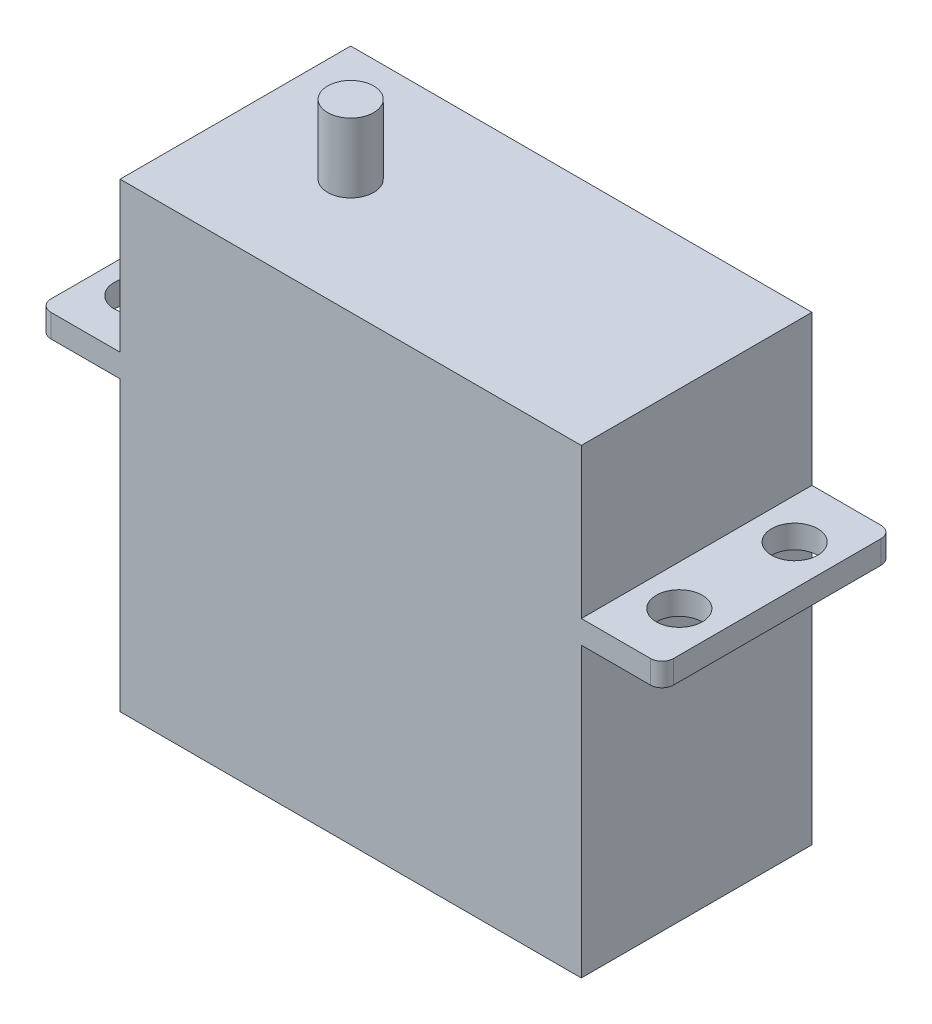
ISO-10303-21;
HEADER;
FILE_DESCRIPTION(('STEP AP214'),'2;1');
FILE_NAME('part.step','',(''),(''),'','','');
FILE_SCHEMA(('AUTOMOTIVE_DESIGN { 1 0 10303 214 1 1 1 1 }'));
ENDSEC;
DATA;
#1=APPLICATION_CONTEXT('core data for automotive mechanical design processes');
#2=APPLICATION_PROTOCOL_DEFINITION('international standard','automotive_design',2000,#1);
#3=PRODUCT_CONTEXT('',#1,'mechanical');
#4=PRODUCT('Part','Part','',(#3));
#5=PRODUCT_RELATED_PRODUCT_CATEGORY('part','',(#4));
#6=PRODUCT_DEFINITION_FORMATION('','',#4);
#7=PRODUCT_DEFINITION_CONTEXT('part definition',#1,'design');
#8=PRODUCT_DEFINITION('design','',#6,#7);
#9=PRODUCT_DEFINITION_SHAPE('','',#8);
#10=(LENGTH_UNIT() NAMED_UNIT(*) SI_UNIT(.MILLI.,.METRE.));
#11=(NAMED_UNIT(*) PLANE_ANGLE_UNIT() SI_UNIT($,.RADIAN.));
#12=(NAMED_UNIT(*) SI_UNIT($,.STERADIAN.) SOLID_ANGLE_UNIT());
#13=UNCERTAINTY_MEASURE_WITH_UNIT(LENGTH_MEASURE(1.E-05),#10,'distance_accuracy_value','');
#14=(GEOMETRIC_REPRESENTATION_CONTEXT(3) GLOBAL_UNCERTAINTY_ASSIGNED_CONTEXT((#13)) GLOBAL_UNIT_ASSIGNED_CONTEXT((#10,
#11,#12)) REPRESENTATION_CONTEXT('',''));
#15=CARTESIAN_POINT('',(0.,0.,0.));
#16=DIRECTION('',(0.,0.,1.));
#17=DIRECTION('',(1.,0.,0.));
#18=AXIS2_PLACEMENT_3D('',#15,#16,#17);
#19=CARTESIAN_POINT('',(40.,25.,20.));
#20=DIRECTION('',(0.,1.,0.));
#21=DIRECTION('',(0.,0.,1.));
#22=AXIS2_PLACEMENT_3D('',#19,#20,#21);
#23=PLANE('',#22);
#24=CARTESIAN_POINT('',(43.5,25.,15.));
#25=DIRECTION('',(0.,1.,0.));
#26=DIRECTION('',(0.,0.,1.));
#27=AXIS2_PLACEMENT_3D('',#24,#25,#26);
#28=CIRCLE('',#27,2.);
#29=CARTESIAN_POINT('',(43.5,25.,17.));
#30=VERTEX_POINT('',#29);
#31=EDGE_CURVE('E498',#30,#30,#28,.F.);
#32=ORIENTED_EDGE('',*,*,#31,.F.);
#33=EDGE_LOOP('',(#32));
#34=FACE_BOUND('',#33,.T.);
#35=DIRECTION('',(1.,0.,0.));
#36=VECTOR('',#35,1.);
#37=CARTESIAN_POINT('',(40.,25.,0.));
#38=LINE('',#37,#36);
#39=CARTESIAN_POINT('',(40.,25.,0.));
#40=VERTEX_POINT('',#39);
#41=CARTESIAN_POINT('',(46.,25.,0.));
#42=VERTEX_POINT('',#41);
#43=EDGE_CURVE('E241',#40,#42,#38,.T.);
#44=ORIENTED_EDGE('',*,*,#43,.T.);
#45=CARTESIAN_POINT('',(46.,25.,1.));
#46=DIRECTION('',(0.,1.,0.));
#47=DIRECTION('',(0.,0.,1.));
#48=AXIS2_PLACEMENT_3D('',#45,#46,#47);
#49=CIRCLE('',#48,1.);
#50=CARTESIAN_POINT('',(47.,25.,1.));
#51=VERTEX_POINT('',#50);
#52=EDGE_CURVE('E43',#42,#51,#49,.F.);
#53=ORIENTED_EDGE('',*,*,#52,.T.);
#54=DIRECTION('',(0.,0.,-1.));
#55=VECTOR('',#54,1.);
#56=CARTESIAN_POINT('',(47.,25.,20.));
#57=LINE('',#56,#55);
#58=CARTESIAN_POINT('',(47.,25.,19.));
#59=VERTEX_POINT('',#58);
#60=EDGE_CURVE('E218',#59,#51,#57,.T.);
#61=ORIENTED_EDGE('',*,*,#60,.F.);
#62=CARTESIAN_POINT('',(46.,25.,19.));
#63=DIRECTION('',(0.,1.,0.));
#64=DIRECTION('',(0.,0.,1.));
#65=AXIS2_PLACEMENT_3D('',#62,#63,#64);
#66=CIRCLE('',#65,1.);
#67=CARTESIAN_POINT('',(46.,25.,20.));
#68=VERTEX_POINT('',#67);
#69=EDGE_CURVE('E211',#59,#68,#66,.F.);
#70=ORIENTED_EDGE('',*,*,#69,.T.);
#71=DIRECTION('',(1.,0.,0.));
#72=VECTOR('',#71,1.);
#73=CARTESIAN_POINT('',(40.,25.,20.));
#74=LINE('',#73,#72);
#75=CARTESIAN_POINT('',(40.,25.,20.));
#76=VERTEX_POINT('',#75);
#77=EDGE_CURVE('E217',#76,#68,#74,.T.);
#78=ORIENTED_EDGE('',*,*,#77,.F.);
#79=DIRECTION('',(0.,0.,-1.));
#80=VECTOR('',#79,1.);
#81=CARTESIAN_POINT('',(40.,25.,20.));
#82=LINE('',#81,#80);
#83=EDGE_CURVE('E180',#76,#40,#82,.T.);
#84=ORIENTED_EDGE('',*,*,#83,.T.);
#85=EDGE_LOOP('',(#44,#53,#61,#70,#78,#84));
#86=FACE_BOUND('',#85,.T.);
#87=CARTESIAN_POINT('',(43.5,25.,5.));
#88=DIRECTION('',(0.,1.,0.));
#89=DIRECTION('',(0.,0.,1.));
#90=AXIS2_PLACEMENT_3D('',#87,#88,#89);
#91=CIRCLE('',#90,2.);
#92=CARTESIAN_POINT('',(43.5,25.,7.));
#93=VERTEX_POINT('',#92);
#94=EDGE_CURVE('E510',#93,#93,#91,.T.);
#95=ORIENTED_EDGE('',*,*,#94,.T.);
#96=EDGE_LOOP('',(#95));
#97=FACE_BOUND('',#96,.T.);
#98=ADVANCED_FACE('F35',(#34,#86,#97),#23,.F.);
#99=CARTESIAN_POINT('',(40.,27.,20.));
#100=DIRECTION('',(0.,-1.,0.));
#101=DIRECTION('',(0.,0.,-1.));
#102=AXIS2_PLACEMENT_3D('',#99,#100,#101);
#103=PLANE('',#102);
#104=CARTESIAN_POINT('',(43.5,27.,15.));
#105=DIRECTION('',(0.,1.,0.));
#106=DIRECTION('',(0.,0.,1.));
#107=AXIS2_PLACEMENT_3D('',#104,#105,#106);
#108=CIRCLE('',#107,2.);
#109=CARTESIAN_POINT('',(43.5,27.,17.));
#110=VERTEX_POINT('',#109);
#111=EDGE_CURVE('E495',#110,#110,#108,.T.);
#112=ORIENTED_EDGE('',*,*,#111,.F.);
#113=EDGE_LOOP('',(#112));
#114=FACE_BOUND('',#113,.T.);
#115=DIRECTION('',(0.,0.,-1.));
#116=VECTOR('',#115,1.);
#117=CARTESIAN_POINT('',(47.,27.,20.));
#118=LINE('',#117,#116);
#119=CARTESIAN_POINT('',(47.,27.,19.));
#120=VERTEX_POINT('',#119);
#121=CARTESIAN_POINT('',(47.,27.,1.));
#122=VERTEX_POINT('',#121);
#123=EDGE_CURVE('E229',#120,#122,#118,.T.);
#124=ORIENTED_EDGE('',*,*,#123,.T.);
#125=CARTESIAN_POINT('',(46.,27.,1.));
#126=DIRECTION('',(0.,-1.,0.));
#127=DIRECTION('',(0.,0.,-1.));
#128=AXIS2_PLACEMENT_3D('',#125,#126,#127);
#129=CIRCLE('',#128,1.);
#130=CARTESIAN_POINT('',(46.,27.,0.));
#131=VERTEX_POINT('',#130);
#132=EDGE_CURVE('E209',#122,#131,#129,.F.);
#133=ORIENTED_EDGE('',*,*,#132,.T.);
#134=DIRECTION('',(-1.,0.,0.));
#135=VECTOR('',#134,1.);
#136=CARTESIAN_POINT('',(40.,27.,0.));
#137=LINE('',#136,#135);
#138=CARTESIAN_POINT('',(40.,27.,0.));
#139=VERTEX_POINT('',#138);
#140=EDGE_CURVE('E250',#131,#139,#137,.T.);
#141=ORIENTED_EDGE('',*,*,#140,.T.);
#142=DIRECTION('',(0.,0.,-1.));
#143=VECTOR('',#142,1.);
#144=CARTESIAN_POINT('',(40.,27.,20.));
#145=LINE('',#144,#143);
#146=CARTESIAN_POINT('',(40.,27.,20.));
#147=VERTEX_POINT('',#146);
#148=EDGE_CURVE('E233',#147,#139,#145,.T.);
#149=ORIENTED_EDGE('',*,*,#148,.F.);
#150=DIRECTION('',(-1.,0.,0.));
#151=VECTOR('',#150,1.);
#152=CARTESIAN_POINT('',(40.,27.,20.));
#153=LINE('',#152,#151);
#154=CARTESIAN_POINT('',(46.,27.,20.));
#155=VERTEX_POINT('',#154);
#156=EDGE_CURVE('E223',#155,#147,#153,.T.);
#157=ORIENTED_EDGE('',*,*,#156,.F.);
#158=CARTESIAN_POINT('',(46.,27.,19.));
#159=DIRECTION('',(0.,-1.,0.));
#160=DIRECTION('',(0.,0.,-1.));
#161=AXIS2_PLACEMENT_3D('',#158,#159,#160);
#162=CIRCLE('',#161,1.);
#163=EDGE_CURVE('E207',#155,#120,#162,.F.);
#164=ORIENTED_EDGE('',*,*,#163,.T.);
#165=EDGE_LOOP('',(#124,#133,#141,#149,#157,#164));
#166=FACE_BOUND('',#165,.T.);
#167=CARTESIAN_POINT('',(43.5,27.,5.));
#168=DIRECTION('',(0.,1.,0.));
#169=DIRECTION('',(0.,0.,1.));
#170=AXIS2_PLACEMENT_3D('',#167,#168,#169);
#171=CIRCLE('',#170,2.);
#172=CARTESIAN_POINT('',(43.5,27.,7.));
#173=VERTEX_POINT('',#172);
#174=EDGE_CURVE('E507',#173,#173,#171,.F.);
#175=ORIENTED_EDGE('',*,*,#174,.T.);
#176=EDGE_LOOP('',(#175));
#177=FACE_BOUND('',#176,.T.);
#178=ADVANCED_FACE('F227',(#114,#166,#177),#103,.F.);
#179=CARTESIAN_POINT('',(0.,0.,20.));
#180=DIRECTION('',(1.,0.,0.));
#181=DIRECTION('',(0.,0.,-1.));
#182=AXIS2_PLACEMENT_3D('',#179,#180,#181);
#183=PLANE('',#182);
#184=DIRECTION('',(0.,-1.,0.));
#185=VECTOR('',#184,1.);
#186=CARTESIAN_POINT('',(0.,0.,0.));
#187=LINE('',#186,#185);
#188=CARTESIAN_POINT('',(0.,25.,0.));
#189=VERTEX_POINT('',#188);
#190=CARTESIAN_POINT('',(0.,0.,0.));
#191=VERTEX_POINT('',#190);
#192=EDGE_CURVE('E175',#189,#191,#187,.T.);
#193=ORIENTED_EDGE('',*,*,#192,.T.);
#194=DIRECTION('',(0.,0.,-1.));
#195=VECTOR('',#194,1.);
#196=CARTESIAN_POINT('',(0.,0.,20.));
#197=LINE('',#196,#195);
#198=CARTESIAN_POINT('',(0.,0.,20.));
#199=VERTEX_POINT('',#198);
#200=EDGE_CURVE('E153',#199,#191,#197,.T.);
#201=ORIENTED_EDGE('',*,*,#200,.F.);
#202=DIRECTION('',(0.,-1.,0.));
#203=VECTOR('',#202,1.);
#204=CARTESIAN_POINT('',(0.,0.,20.));
#205=LINE('',#204,#203);
#206=CARTESIAN_POINT('',(0.,25.,20.));
#207=VERTEX_POINT('',#206);
#208=EDGE_CURVE('E160',#207,#199,#205,.T.);
#209=ORIENTED_EDGE('',*,*,#208,.F.);
#210=DIRECTION('',(0.,0.,-1.));
#211=VECTOR('',#210,1.);
#212=CARTESIAN_POINT('',(0.,25.,20.));
#213=LINE('',#212,#211);
#214=EDGE_CURVE('E267',#207,#189,#213,.T.);
#215=ORIENTED_EDGE('',*,*,#214,.T.);
#216=EDGE_LOOP('',(#193,#201,#209,#215));
#217=FACE_BOUND('',#216,.T.);
#218=ADVANCED_FACE('F173',(#217),#183,.F.);
#219=CARTESIAN_POINT('',(0.,0.,20.));
#220=DIRECTION('',(0.,1.,0.));
#221=DIRECTION('',(0.,0.,1.));
#222=AXIS2_PLACEMENT_3D('',#219,#220,#221);
#223=PLANE('',#222);
#224=DIRECTION('',(1.,0.,0.));
#225=VECTOR('',#224,1.);
#226=CARTESIAN_POINT('',(0.,0.,0.));
#227=LINE('',#226,#225);
#228=CARTESIAN_POINT('',(40.,0.,0.));
#229=VERTEX_POINT('',#228);
#230=EDGE_CURVE('E254',#191,#229,#227,.T.);
#231=ORIENTED_EDGE('',*,*,#230,.T.);
#232=DIRECTION('',(0.,0.,-1.));
#233=VECTOR('',#232,1.);
#234=CARTESIAN_POINT('',(40.,0.,20.));
#235=LINE('',#234,#233);
#236=CARTESIAN_POINT('',(40.,0.,20.));
#237=VERTEX_POINT('',#236);
#238=EDGE_CURVE('E156',#237,#229,#235,.T.);
#239=ORIENTED_EDGE('',*,*,#238,.F.);
#240=DIRECTION('',(1.,0.,0.));
#241=VECTOR('',#240,1.);
#242=CARTESIAN_POINT('',(0.,0.,20.));
#243=LINE('',#242,#241);
#244=EDGE_CURVE('E149',#199,#237,#243,.T.);
#245=ORIENTED_EDGE('',*,*,#244,.F.);
#246=ORIENTED_EDGE('',*,*,#200,.T.);
#247=EDGE_LOOP('',(#231,#239,#245,#246));
#248=FACE_BOUND('',#247,.T.);
#249=ADVANCED_FACE('F151',(#248),#223,.F.);
#250=CARTESIAN_POINT('',(40.,0.,20.));
#251=DIRECTION('',(-1.,0.,0.));
#252=DIRECTION('',(0.,0.,1.));
#253=AXIS2_PLACEMENT_3D('',#250,#251,#252);
#254=PLANE('',#253);
#255=DIRECTION('',(0.,1.,0.));
#256=VECTOR('',#255,1.);
#257=CARTESIAN_POINT('',(40.,0.,0.));
#258=LINE('',#257,#256);
#259=EDGE_CURVE('E247',#229,#40,#258,.T.);
#260=ORIENTED_EDGE('',*,*,#259,.T.);
#261=ORIENTED_EDGE('',*,*,#83,.F.);
#262=DIRECTION('',(0.,1.,0.));
#263=VECTOR('',#262,1.);
#264=CARTESIAN_POINT('',(40.,0.,20.));
#265=LINE('',#264,#263);
#266=EDGE_CURVE('E159',#237,#76,#265,.T.);
#267=ORIENTED_EDGE('',*,*,#266,.F.);
#268=ORIENTED_EDGE('',*,*,#238,.T.);
#269=EDGE_LOOP('',(#260,#261,#267,#268));
#270=FACE_BOUND('',#269,.T.);
#271=ADVANCED_FACE('F312',(#270),#254,.F.);
#272=CARTESIAN_POINT('',(47.,25.,20.));
#273=DIRECTION('',(-1.,0.,0.));
#274=DIRECTION('',(0.,0.,1.));
#275=AXIS2_PLACEMENT_3D('',#272,#273,#274);
#276=PLANE('',#275);
#277=ORIENTED_EDGE('',*,*,#60,.T.);
#278=DIRECTION('',(0.,1.,0.));
#279=VECTOR('',#278,1.);
#280=CARTESIAN_POINT('',(47.,25.,1.));
#281=LINE('',#280,#279);
#282=EDGE_CURVE('E204',#51,#122,#281,.T.);
#283=ORIENTED_EDGE('',*,*,#282,.T.);
#284=ORIENTED_EDGE('',*,*,#123,.F.);
#285=DIRECTION('',(0.,1.,0.));
#286=VECTOR('',#285,1.);
#287=CARTESIAN_POINT('',(47.,25.,19.));
#288=LINE('',#287,#286);
#289=EDGE_CURVE('E56',#120,#59,#288,.F.);
#290=ORIENTED_EDGE('',*,*,#289,.T.);
#291=EDGE_LOOP('',(#277,#283,#284,#290));
#292=FACE_BOUND('',#291,.T.);
#293=ADVANCED_FACE('F231',(#292),#276,.F.);
#294=CARTESIAN_POINT('',(40.,27.,20.));
#295=DIRECTION('',(-1.,0.,0.));
#296=DIRECTION('',(0.,0.,1.));
#297=AXIS2_PLACEMENT_3D('',#294,#295,#296);
#298=PLANE('',#297);
#299=DIRECTION('',(0.,1.,0.));
#300=VECTOR('',#299,1.);
#301=CARTESIAN_POINT('',(40.,27.,0.));
#302=LINE('',#301,#300);
#303=CARTESIAN_POINT('',(40.,40.,0.));
#304=VERTEX_POINT('',#303);
#305=EDGE_CURVE('E252',#139,#304,#302,.T.);
#306=ORIENTED_EDGE('',*,*,#305,.T.);
#307=DIRECTION('',(0.,0.,-1.));
#308=VECTOR('',#307,1.);
#309=CARTESIAN_POINT('',(40.,40.,20.));
#310=LINE('',#309,#308);
#311=CARTESIAN_POINT('',(40.,40.,20.));
#312=VERTEX_POINT('',#311);
#313=EDGE_CURVE('E237',#312,#304,#310,.T.);
#314=ORIENTED_EDGE('',*,*,#313,.F.);
#315=DIRECTION('',(0.,1.,0.));
#316=VECTOR('',#315,1.);
#317=CARTESIAN_POINT('',(40.,27.,20.));
#318=LINE('',#317,#316);
#319=EDGE_CURVE('E316',#147,#312,#318,.T.);
#320=ORIENTED_EDGE('',*,*,#319,.F.);
#321=ORIENTED_EDGE('',*,*,#148,.T.);
#322=EDGE_LOOP('',(#306,#314,#320,#321));
#323=FACE_BOUND('',#322,.T.);
#324=ADVANCED_FACE('F317',(#323),#298,.F.);
#325=CARTESIAN_POINT('',(0.,40.,20.));
#326=DIRECTION('',(0.,-1.,0.));
#327=DIRECTION('',(0.,0.,-1.));
#328=AXIS2_PLACEMENT_3D('',#325,#326,#327);
#329=PLANE('',#328);
#330=CARTESIAN_POINT('',(10.,40.,10.));
#331=DIRECTION('',(0.,-1.,0.));
#332=DIRECTION('',(0.,0.,-1.));
#333=AXIS2_PLACEMENT_3D('',#330,#331,#332);
#334=CIRCLE('',#333,2.);
#335=CARTESIAN_POINT('',(10.,40.,8.));
#336=VERTEX_POINT('',#335);
#337=EDGE_CURVE('E11',#336,#336,#334,.F.);
#338=ORIENTED_EDGE('',*,*,#337,.F.);
#339=EDGE_LOOP('',(#338));
#340=FACE_BOUND('',#339,.T.);
#341=DIRECTION('',(-1.,0.,0.));
#342=VECTOR('',#341,1.);
#343=CARTESIAN_POINT('',(0.,40.,0.));
#344=LINE('',#343,#342);
#345=CARTESIAN_POINT('',(0.,40.,0.));
#346=VERTEX_POINT('',#345);
#347=EDGE_CURVE('E259',#304,#346,#344,.T.);
#348=ORIENTED_EDGE('',*,*,#347,.T.);
#349=DIRECTION('',(0.,0.,-1.));
#350=VECTOR('',#349,1.);
#351=CARTESIAN_POINT('',(0.,40.,20.));
#352=LINE('',#351,#350);
#353=CARTESIAN_POINT('',(0.,40.,20.));
#354=VERTEX_POINT('',#353);
#355=EDGE_CURVE('E278',#354,#346,#352,.T.);
#356=ORIENTED_EDGE('',*,*,#355,.F.);
#357=DIRECTION('',(-1.,0.,0.));
#358=VECTOR('',#357,1.);
#359=CARTESIAN_POINT('',(0.,40.,20.));
#360=LINE('',#359,#358);
#361=EDGE_CURVE('E287',#312,#354,#360,.T.);
#362=ORIENTED_EDGE('',*,*,#361,.F.);
#363=ORIENTED_EDGE('',*,*,#313,.T.);
#364=EDGE_LOOP('',(#348,#356,#362,#363));
#365=FACE_BOUND('',#364,.T.);
#366=ADVANCED_FACE('F285',(#340,#365),#329,.F.);
#367=CARTESIAN_POINT('',(0.,27.,20.));
#368=DIRECTION('',(1.,0.,0.));
#369=DIRECTION('',(0.,0.,-1.));
#370=AXIS2_PLACEMENT_3D('',#367,#368,#369);
#371=PLANE('',#370);
#372=DIRECTION('',(0.,-1.,0.));
#373=VECTOR('',#372,1.);
#374=CARTESIAN_POINT('',(0.,27.,0.));
#375=LINE('',#374,#373);
#376=CARTESIAN_POINT('',(0.,27.,0.));
#377=VERTEX_POINT('',#376);
#378=EDGE_CURVE('E261',#346,#377,#375,.T.);
#379=ORIENTED_EDGE('',*,*,#378,.T.);
#380=DIRECTION('',(0.,0.,-1.));
#381=VECTOR('',#380,1.);
#382=CARTESIAN_POINT('',(0.,27.,20.));
#383=LINE('',#382,#381);
#384=CARTESIAN_POINT('',(0.,27.,20.));
#385=VERTEX_POINT('',#384);
#386=EDGE_CURVE('E275',#385,#377,#383,.T.);
#387=ORIENTED_EDGE('',*,*,#386,.F.);
#388=DIRECTION('',(0.,-1.,0.));
#389=VECTOR('',#388,1.);
#390=CARTESIAN_POINT('',(0.,27.,20.));
#391=LINE('',#390,#389);
#392=EDGE_CURVE('E305',#354,#385,#391,.T.);
#393=ORIENTED_EDGE('',*,*,#392,.F.);
#394=ORIENTED_EDGE('',*,*,#355,.T.);
#395=EDGE_LOOP('',(#379,#387,#393,#394));
#396=FACE_BOUND('',#395,.T.);
#397=ADVANCED_FACE('F295',(#396),#371,.F.);
#398=CARTESIAN_POINT('',(0.,27.,20.));
#399=DIRECTION('',(0.,-1.,0.));
#400=DIRECTION('',(0.,0.,-1.));
#401=AXIS2_PLACEMENT_3D('',#398,#399,#400);
#402=PLANE('',#401);
#403=CARTESIAN_POINT('',(-3.5,27.,15.));
#404=DIRECTION('',(0.,1.,0.));
#405=DIRECTION('',(0.,0.,1.));
#406=AXIS2_PLACEMENT_3D('',#403,#404,#405);
#407=CIRCLE('',#406,2.);
#408=CARTESIAN_POINT('',(-3.5,27.,17.));
#409=VERTEX_POINT('',#408);
#410=EDGE_CURVE('E501',#409,#409,#407,.F.);
#411=ORIENTED_EDGE('',*,*,#410,.T.);
#412=EDGE_LOOP('',(#411));
#413=FACE_BOUND('',#412,.T.);
#414=CARTESIAN_POINT('',(-3.5,27.,5.));
#415=DIRECTION('',(0.,1.,0.));
#416=DIRECTION('',(0.,0.,1.));
#417=AXIS2_PLACEMENT_3D('',#414,#415,#416);
#418=CIRCLE('',#417,2.);
#419=CARTESIAN_POINT('',(-3.5,27.,7.));
#420=VERTEX_POINT('',#419);
#421=EDGE_CURVE('E504',#420,#420,#418,.T.);
#422=ORIENTED_EDGE('',*,*,#421,.F.);
#423=EDGE_LOOP('',(#422));
#424=FACE_BOUND('',#423,.T.);
#425=DIRECTION('',(-1.,0.,0.));
#426=VECTOR('',#425,1.);
#427=CARTESIAN_POINT('',(0.,27.,0.));
#428=LINE('',#427,#426);
#429=CARTESIAN_POINT('',(-6.,27.,0.));
#430=VERTEX_POINT('',#429);
#431=EDGE_CURVE('E263',#377,#430,#428,.T.);
#432=ORIENTED_EDGE('',*,*,#431,.T.);
#433=CARTESIAN_POINT('',(-6.,27.,1.));
#434=DIRECTION('',(0.,-1.,0.));
#435=DIRECTION('',(0.,0.,-1.));
#436=AXIS2_PLACEMENT_3D('',#433,#434,#435);
#437=CIRCLE('',#436,1.);
#438=CARTESIAN_POINT('',(-7.,27.,1.));
#439=VERTEX_POINT('',#438);
#440=EDGE_CURVE('E196',#430,#439,#437,.F.);
#441=ORIENTED_EDGE('',*,*,#440,.T.);
#442=DIRECTION('',(0.,0.,-1.));
#443=VECTOR('',#442,1.);
#444=CARTESIAN_POINT('',(-7.,27.,20.));
#445=LINE('',#444,#443);
#446=CARTESIAN_POINT('',(-7.,27.,19.));
#447=VERTEX_POINT('',#446);
#448=EDGE_CURVE('E272',#447,#439,#445,.T.);
#449=ORIENTED_EDGE('',*,*,#448,.F.);
#450=CARTESIAN_POINT('',(-6.,27.,19.));
#451=DIRECTION('',(0.,-1.,0.));
#452=DIRECTION('',(0.,0.,-1.));
#453=AXIS2_PLACEMENT_3D('',#450,#451,#452);
#454=CIRCLE('',#453,1.);
#455=CARTESIAN_POINT('',(-6.,27.,20.));
#456=VERTEX_POINT('',#455);
#457=EDGE_CURVE('E194',#447,#456,#454,.F.);
#458=ORIENTED_EDGE('',*,*,#457,.T.);
#459=DIRECTION('',(-1.,0.,0.));
#460=VECTOR('',#459,1.);
#461=CARTESIAN_POINT('',(0.,27.,20.));
#462=LINE('',#461,#460);
#463=EDGE_CURVE('E301',#385,#456,#462,.T.);
#464=ORIENTED_EDGE('',*,*,#463,.F.);
#465=ORIENTED_EDGE('',*,*,#386,.T.);
#466=EDGE_LOOP('',(#432,#441,#449,#458,#464,#465));
#467=FACE_BOUND('',#466,.T.);
#468=ADVANCED_FACE('F299',(#413,#424,#467),#402,.F.);
#469=CARTESIAN_POINT('',(-7.,25.,20.));
#470=DIRECTION('',(1.,0.,0.));
#471=DIRECTION('',(0.,0.,-1.));
#472=AXIS2_PLACEMENT_3D('',#469,#470,#471);
#473=PLANE('',#472);
#474=ORIENTED_EDGE('',*,*,#448,.T.);
#475=DIRECTION('',(0.,-1.,0.));
#476=VECTOR('',#475,1.);
#477=CARTESIAN_POINT('',(-7.,25.,1.));
#478=LINE('',#477,#476);
#479=CARTESIAN_POINT('',(-7.,25.,1.));
#480=VERTEX_POINT('',#479);
#481=EDGE_CURVE('E178',#439,#480,#478,.T.);
#482=ORIENTED_EDGE('',*,*,#481,.T.);
#483=DIRECTION('',(0.,0.,-1.));
#484=VECTOR('',#483,1.);
#485=CARTESIAN_POINT('',(-7.,25.,20.));
#486=LINE('',#485,#484);
#487=CARTESIAN_POINT('',(-7.,25.,19.));
#488=VERTEX_POINT('',#487);
#489=EDGE_CURVE('E269',#488,#480,#486,.T.);
#490=ORIENTED_EDGE('',*,*,#489,.F.);
#491=DIRECTION('',(0.,-1.,0.));
#492=VECTOR('',#491,1.);
#493=CARTESIAN_POINT('',(-7.,27.,19.));
#494=LINE('',#493,#492);
#495=EDGE_CURVE('E176',#488,#447,#494,.F.);
#496=ORIENTED_EDGE('',*,*,#495,.T.);
#497=EDGE_LOOP('',(#474,#482,#490,#496));
#498=FACE_BOUND('',#497,.T.);
#499=ADVANCED_FACE('F356',(#498),#473,.F.);
#500=CARTESIAN_POINT('',(0.,25.,20.));
#501=DIRECTION('',(0.,1.,0.));
#502=DIRECTION('',(0.,0.,1.));
#503=AXIS2_PLACEMENT_3D('',#500,#501,#502);
#504=PLANE('',#503);
#505=CARTESIAN_POINT('',(-3.5,25.,15.));
#506=DIRECTION('',(0.,1.,0.));
#507=DIRECTION('',(0.,0.,1.));
#508=AXIS2_PLACEMENT_3D('',#505,#506,#507);
#509=CIRCLE('',#508,2.);
#510=CARTESIAN_POINT('',(-3.5,25.,17.));
#511=VERTEX_POINT('',#510);
#512=EDGE_CURVE('E505',#511,#511,#509,.T.);
#513=ORIENTED_EDGE('',*,*,#512,.T.);
#514=EDGE_LOOP('',(#513));
#515=FACE_BOUND('',#514,.T.);
#516=CARTESIAN_POINT('',(-3.5,25.,5.));
#517=DIRECTION('',(0.,1.,0.));
#518=DIRECTION('',(0.,0.,1.));
#519=AXIS2_PLACEMENT_3D('',#516,#517,#518);
#520=CIRCLE('',#519,2.);
#521=CARTESIAN_POINT('',(-3.5,25.,7.));
#522=VERTEX_POINT('',#521);
#523=EDGE_CURVE('E311',#522,#522,#520,.F.);
#524=ORIENTED_EDGE('',*,*,#523,.F.);
#525=EDGE_LOOP('',(#524));
#526=FACE_BOUND('',#525,.T.);
#527=ORIENTED_EDGE('',*,*,#489,.T.);
#528=CARTESIAN_POINT('',(-6.,25.,1.));
#529=DIRECTION('',(0.,1.,0.));
#530=DIRECTION('',(0.,0.,1.));
#531=AXIS2_PLACEMENT_3D('',#528,#529,#530);
#532=CIRCLE('',#531,1.);
#533=CARTESIAN_POINT('',(-6.,25.,0.));
#534=VERTEX_POINT('',#533);
#535=EDGE_CURVE('E188',#480,#534,#532,.F.);
#536=ORIENTED_EDGE('',*,*,#535,.T.);
#537=DIRECTION('',(1.,0.,0.));
#538=VECTOR('',#537,1.);
#539=CARTESIAN_POINT('',(0.,25.,0.));
#540=LINE('',#539,#538);
#541=EDGE_CURVE('E171',#534,#189,#540,.T.);
#542=ORIENTED_EDGE('',*,*,#541,.T.);
#543=ORIENTED_EDGE('',*,*,#214,.F.);
#544=DIRECTION('',(1.,0.,0.));
#545=VECTOR('',#544,1.);
#546=CARTESIAN_POINT('',(0.,25.,20.));
#547=LINE('',#546,#545);
#548=CARTESIAN_POINT('',(-6.,25.,20.));
#549=VERTEX_POINT('',#548);
#550=EDGE_CURVE('E167',#549,#207,#547,.T.);
#551=ORIENTED_EDGE('',*,*,#550,.F.);
#552=CARTESIAN_POINT('',(-6.,25.,19.));
#553=DIRECTION('',(0.,1.,0.));
#554=DIRECTION('',(0.,0.,1.));
#555=AXIS2_PLACEMENT_3D('',#552,#553,#554);
#556=CIRCLE('',#555,1.);
#557=EDGE_CURVE('E186',#549,#488,#556,.F.);
#558=ORIENTED_EDGE('',*,*,#557,.T.);
#559=EDGE_LOOP('',(#527,#536,#542,#543,#551,#558));
#560=FACE_BOUND('',#559,.T.);
#561=ADVANCED_FACE('F360',(#515,#526,#560),#504,.F.);
#562=CARTESIAN_POINT('',(0.,0.,20.));
#563=DIRECTION('',(0.,0.,1.));
#564=DIRECTION('',(1.,0.,0.));
#565=AXIS2_PLACEMENT_3D('',#562,#563,#564);
#566=PLANE('',#565);
#567=ORIENTED_EDGE('',*,*,#463,.T.);
#568=DIRECTION('',(0.,-1.,0.));
#569=VECTOR('',#568,1.);
#570=CARTESIAN_POINT('',(-6.,25.,20.));
#571=LINE('',#570,#569);
#572=EDGE_CURVE('E201',#456,#549,#571,.T.);
#573=ORIENTED_EDGE('',*,*,#572,.T.);
#574=ORIENTED_EDGE('',*,*,#550,.T.);
#575=ORIENTED_EDGE('',*,*,#208,.T.);
#576=ORIENTED_EDGE('',*,*,#244,.T.);
#577=ORIENTED_EDGE('',*,*,#266,.T.);
#578=ORIENTED_EDGE('',*,*,#77,.T.);
#579=DIRECTION('',(0.,1.,0.));
#580=VECTOR('',#579,1.);
#581=CARTESIAN_POINT('',(46.,27.,20.));
#582=LINE('',#581,#580);
#583=EDGE_CURVE('E198',#68,#155,#582,.T.);
#584=ORIENTED_EDGE('',*,*,#583,.T.);
#585=ORIENTED_EDGE('',*,*,#156,.T.);
#586=ORIENTED_EDGE('',*,*,#319,.T.);
#587=ORIENTED_EDGE('',*,*,#361,.T.);
#588=ORIENTED_EDGE('',*,*,#392,.T.);
#589=EDGE_LOOP('',(#567,#573,#574,#575,#576,#577,#578,#584,#585,#586,#587,#588));
#590=FACE_BOUND('',#589,.T.);
#591=ADVANCED_FACE('F164',(#590),#566,.T.);
#592=CARTESIAN_POINT('',(0.,0.,0.));
#593=DIRECTION('',(0.,0.,1.));
#594=DIRECTION('',(1.,0.,0.));
#595=AXIS2_PLACEMENT_3D('',#592,#593,#594);
#596=PLANE('',#595);
#597=ORIENTED_EDGE('',*,*,#541,.F.);
#598=DIRECTION('',(0.,-1.,0.));
#599=VECTOR('',#598,1.);
#600=CARTESIAN_POINT('',(-6.,0.,0.));
#601=LINE('',#600,#599);
#602=EDGE_CURVE('E192',#534,#430,#601,.F.);
#603=ORIENTED_EDGE('',*,*,#602,.T.);
#604=ORIENTED_EDGE('',*,*,#431,.F.);
#605=ORIENTED_EDGE('',*,*,#378,.F.);
#606=ORIENTED_EDGE('',*,*,#347,.F.);
#607=ORIENTED_EDGE('',*,*,#305,.F.);
#608=ORIENTED_EDGE('',*,*,#140,.F.);
#609=DIRECTION('',(0.,1.,0.));
#610=VECTOR('',#609,1.);
#611=CARTESIAN_POINT('',(46.,0.,0.));
#612=LINE('',#611,#610);
#613=EDGE_CURVE('E190',#131,#42,#612,.F.);
#614=ORIENTED_EDGE('',*,*,#613,.T.);
#615=ORIENTED_EDGE('',*,*,#43,.F.);
#616=ORIENTED_EDGE('',*,*,#259,.F.);
#617=ORIENTED_EDGE('',*,*,#230,.F.);
#618=ORIENTED_EDGE('',*,*,#192,.F.);
#619=EDGE_LOOP('',(#597,#603,#604,#605,#606,#607,#608,#614,#615,#616,#617,#618));
#620=FACE_BOUND('',#619,.T.);
#621=ADVANCED_FACE('F246',(#620),#596,.F.);
#622=CARTESIAN_POINT('',(-6.,25.,1.));
#623=DIRECTION('',(0.,-1.,0.));
#624=DIRECTION('',(0.,0.,-1.));
#625=AXIS2_PLACEMENT_3D('',#622,#623,#624);
#626=CYLINDRICAL_SURFACE('',#625,1.);
#627=ORIENTED_EDGE('',*,*,#440,.F.);
#628=ORIENTED_EDGE('',*,*,#602,.F.);
#629=ORIENTED_EDGE('',*,*,#535,.F.);
#630=ORIENTED_EDGE('',*,*,#481,.F.);
#631=EDGE_LOOP('',(#627,#628,#629,#630));
#632=FACE_BOUND('',#631,.T.);
#633=ADVANCED_FACE('F327',(#632),#626,.T.);
#634=CARTESIAN_POINT('',(-6.,0.,19.));
#635=DIRECTION('',(0.,1.,0.));
#636=DIRECTION('',(0.,0.,1.));
#637=AXIS2_PLACEMENT_3D('',#634,#635,#636);
#638=CYLINDRICAL_SURFACE('',#637,1.);
#639=ORIENTED_EDGE('',*,*,#457,.F.);
#640=ORIENTED_EDGE('',*,*,#495,.F.);
#641=ORIENTED_EDGE('',*,*,#557,.F.);
#642=ORIENTED_EDGE('',*,*,#572,.F.);
#643=EDGE_LOOP('',(#639,#640,#641,#642));
#644=FACE_BOUND('',#643,.T.);
#645=ADVANCED_FACE('F321',(#644),#638,.T.);
#646=CARTESIAN_POINT('',(46.,25.,1.));
#647=DIRECTION('',(0.,1.,0.));
#648=DIRECTION('',(0.,0.,1.));
#649=AXIS2_PLACEMENT_3D('',#646,#647,#648);
#650=CYLINDRICAL_SURFACE('',#649,1.);
#651=ORIENTED_EDGE('',*,*,#52,.F.);
#652=ORIENTED_EDGE('',*,*,#613,.F.);
#653=ORIENTED_EDGE('',*,*,#132,.F.);
#654=ORIENTED_EDGE('',*,*,#282,.F.);
#655=EDGE_LOOP('',(#651,#652,#653,#654));
#656=FACE_BOUND('',#655,.T.);
#657=ADVANCED_FACE('F319',(#656),#650,.T.);
#658=CARTESIAN_POINT('',(46.,0.,19.));
#659=DIRECTION('',(0.,-1.,0.));
#660=DIRECTION('',(0.,0.,-1.));
#661=AXIS2_PLACEMENT_3D('',#658,#659,#660);
#662=CYLINDRICAL_SURFACE('',#661,1.);
#663=ORIENTED_EDGE('',*,*,#69,.F.);
#664=ORIENTED_EDGE('',*,*,#289,.F.);
#665=ORIENTED_EDGE('',*,*,#163,.F.);
#666=ORIENTED_EDGE('',*,*,#583,.F.);
#667=EDGE_LOOP('',(#663,#664,#665,#666));
#668=FACE_BOUND('',#667,.T.);
#669=ADVANCED_FACE('F37',(#668),#662,.T.);
#670=CARTESIAN_POINT('',(-3.5,-0.001000000000001,5.));
#671=DIRECTION('',(0.,1.,0.));
#672=DIRECTION('',(0.,0.,1.));
#673=AXIS2_PLACEMENT_3D('',#670,#671,#672);
#674=CYLINDRICAL_SURFACE('',#673,2.);
#675=CARTESIAN_POINT('',(-3.5,27.,7.));
#676=CARTESIAN_POINT('',(-3.5,26.9791666666667,7.));
#677=CARTESIAN_POINT('',(-3.5,26.9583333333333,7.));
#678=CARTESIAN_POINT('',(-3.5,26.9166666666667,7.));
#679=CARTESIAN_POINT('',(-3.5,26.8958333333333,7.));
#680=CARTESIAN_POINT('',(-3.5,26.8541666666667,7.));
#681=CARTESIAN_POINT('',(-3.5,26.8333333333333,7.));
#682=CARTESIAN_POINT('',(-3.5,26.7916666666667,7.));
#683=CARTESIAN_POINT('',(-3.5,26.7708333333333,7.));
#684=CARTESIAN_POINT('',(-3.5,26.7291666666667,7.));
#685=CARTESIAN_POINT('',(-3.5,26.7083333333333,7.));
#686=CARTESIAN_POINT('',(-3.5,26.6666666666667,7.));
#687=CARTESIAN_POINT('',(-3.5,26.6458333333333,7.));
#688=CARTESIAN_POINT('',(-3.5,26.6041666666667,7.));
#689=CARTESIAN_POINT('',(-3.5,26.5833333333333,7.));
#690=CARTESIAN_POINT('',(-3.5,26.5416666666667,7.));
#691=CARTESIAN_POINT('',(-3.5,26.5208333333333,7.));
#692=CARTESIAN_POINT('',(-3.5,26.4791666666667,7.));
#693=CARTESIAN_POINT('',(-3.5,26.4583333333333,7.));
#694=CARTESIAN_POINT('',(-3.5,26.4166666666667,7.));
#695=CARTESIAN_POINT('',(-3.5,26.3958333333333,7.));
#696=CARTESIAN_POINT('',(-3.5,26.3541666666667,7.));
#697=CARTESIAN_POINT('',(-3.5,26.3333333333333,7.));
#698=CARTESIAN_POINT('',(-3.5,26.2916666666667,7.));
#699=CARTESIAN_POINT('',(-3.5,26.2708333333333,7.));
#700=CARTESIAN_POINT('',(-3.5,26.2291666666667,7.));
#701=CARTESIAN_POINT('',(-3.5,26.2083333333333,7.));
#702=CARTESIAN_POINT('',(-3.5,26.1666666666667,7.));
#703=CARTESIAN_POINT('',(-3.5,26.1458333333333,7.));
#704=CARTESIAN_POINT('',(-3.5,26.1041666666667,7.));
#705=CARTESIAN_POINT('',(-3.5,26.0833333333333,7.));
#706=CARTESIAN_POINT('',(-3.5,26.0416666666667,7.));
#707=CARTESIAN_POINT('',(-3.5,26.0208333333333,7.));
#708=CARTESIAN_POINT('',(-3.5,25.9791666666667,7.));
#709=CARTESIAN_POINT('',(-3.5,25.9583333333333,7.));
#710=CARTESIAN_POINT('',(-3.5,25.9166666666667,7.));
#711=CARTESIAN_POINT('',(-3.5,25.8958333333333,7.));
#712=CARTESIAN_POINT('',(-3.5,25.8541666666667,7.));
#713=CARTESIAN_POINT('',(-3.5,25.8333333333333,7.));
#714=CARTESIAN_POINT('',(-3.5,25.7916666666667,7.));
#715=CARTESIAN_POINT('',(-3.5,25.7708333333333,7.));
#716=CARTESIAN_POINT('',(-3.5,25.7291666666667,7.));
#717=CARTESIAN_POINT('',(-3.5,25.7083333333333,7.));
#718=CARTESIAN_POINT('',(-3.5,25.6666666666667,7.));
#719=CARTESIAN_POINT('',(-3.5,25.6458333333333,7.));
#720=CARTESIAN_POINT('',(-3.5,25.6041666666667,7.));
#721=CARTESIAN_POINT('',(-3.5,25.5833333333333,7.));
#722=CARTESIAN_POINT('',(-3.5,25.5416666666667,7.));
#723=CARTESIAN_POINT('',(-3.5,25.5208333333333,7.));
#724=CARTESIAN_POINT('',(-3.5,25.4791666666667,7.));
#725=CARTESIAN_POINT('',(-3.5,25.4583333333333,7.));
#726=CARTESIAN_POINT('',(-3.5,25.4166666666667,7.));
#727=CARTESIAN_POINT('',(-3.5,25.3958333333333,7.));
#728=CARTESIAN_POINT('',(-3.5,25.3541666666667,7.));
#729=CARTESIAN_POINT('',(-3.5,25.3333333333333,7.));
#730=CARTESIAN_POINT('',(-3.5,25.2916666666667,7.));
#731=CARTESIAN_POINT('',(-3.5,25.2708333333333,7.));
#732=CARTESIAN_POINT('',(-3.5,25.2291666666667,7.));
#733=CARTESIAN_POINT('',(-3.5,25.2083333333333,7.));
#734=CARTESIAN_POINT('',(-3.5,25.1666666666667,7.));
#735=CARTESIAN_POINT('',(-3.5,25.1458333333333,7.));
#736=CARTESIAN_POINT('',(-3.5,25.1041666666667,7.));
#737=CARTESIAN_POINT('',(-3.5,25.0833333333333,7.));
#738=CARTESIAN_POINT('',(-3.5,25.0416666666667,7.));
#739=CARTESIAN_POINT('',(-3.5,25.0208333333333,7.));
#740=CARTESIAN_POINT('',(-3.5,25.,7.));
#741=B_SPLINE_CURVE_WITH_KNOTS('',3,(#675,#676,#677,#678,#679,#680,#681,#682,#683,#684,#685,
#686,#687,#688,#689,#690,#691,#692,#693,#694,#695,#696,#697,#698,#699,#700,#701,#702,#703,#704,
#705,#706,#707,#708,#709,#710,#711,#712,#713,#714,#715,#716,#717,#718,#719,#720,#721,#722,#723,
#724,#725,#726,#727,#728,#729,#730,#731,#732,#733,#734,#735,#736,#737,#738,#739,#740),
.UNSPECIFIED.,.F.,.F.,(4,2,2,2,2,2,2,2,2,2,2,2,2,2,2,2,2,2,2,2,2,2,2,2,2,2,2,2,2,2,2,2,4),(0.,
0.0625000000000001,0.125,0.1875,0.25,0.3125,0.375,0.4375,0.5,0.5625,0.625000000000001,
0.687500000000001,0.750000000000001,0.812500000000001,0.875000000000001,0.937500000000001,1.,
1.0625,1.125,1.1875,1.25,1.3125,1.375,1.4375,1.5,1.5625,1.625,1.6875,1.75,1.8125,1.875,1.9375,
2.),.UNSPECIFIED.);
#742=EDGE_CURVE('BSEAM326',#420,#522,#741,.T.);
#743=ORIENTED_EDGE('',*,*,#421,.T.);
#744=ORIENTED_EDGE('',*,*,#523,.T.);
#745=ORIENTED_EDGE('',*,*,#742,.T.);
#746=ORIENTED_EDGE('',*,*,#742,.F.);
#747=EDGE_LOOP('',(#743,#745,#744,#746));
#748=FACE_BOUND('',#747,.T.);
#749=ADVANCED_FACE('F326',(#748),#674,.F.);
#750=CARTESIAN_POINT('',(-3.5,-0.001000000000001,15.));
#751=DIRECTION('',(0.,1.,0.));
#752=DIRECTION('',(0.,0.,1.));
#753=AXIS2_PLACEMENT_3D('',#750,#751,#752);
#754=CYLINDRICAL_SURFACE('',#753,2.);
#755=CARTESIAN_POINT('',(-3.5,27.,17.));
#756=CARTESIAN_POINT('',(-3.5,26.9791666666667,17.));
#757=CARTESIAN_POINT('',(-3.5,26.9583333333333,17.));
#758=CARTESIAN_POINT('',(-3.5,26.9166666666667,17.));
#759=CARTESIAN_POINT('',(-3.5,26.8958333333333,17.));
#760=CARTESIAN_POINT('',(-3.5,26.8541666666667,17.));
#761=CARTESIAN_POINT('',(-3.5,26.8333333333333,17.));
#762=CARTESIAN_POINT('',(-3.5,26.7916666666667,17.));
#763=CARTESIAN_POINT('',(-3.5,26.7708333333333,17.));
#764=CARTESIAN_POINT('',(-3.5,26.7291666666667,17.));
#765=CARTESIAN_POINT('',(-3.5,26.7083333333333,17.));
#766=CARTESIAN_POINT('',(-3.5,26.6666666666667,17.));
#767=CARTESIAN_POINT('',(-3.5,26.6458333333333,17.));
#768=CARTESIAN_POINT('',(-3.5,26.6041666666667,17.));
#769=CARTESIAN_POINT('',(-3.5,26.5833333333333,17.));
#770=CARTESIAN_POINT('',(-3.5,26.5416666666667,17.));
#771=CARTESIAN_POINT('',(-3.5,26.5208333333333,17.));
#772=CARTESIAN_POINT('',(-3.5,26.4791666666667,17.));
#773=CARTESIAN_POINT('',(-3.5,26.4583333333333,17.));
#774=CARTESIAN_POINT('',(-3.5,26.4166666666667,17.));
#775=CARTESIAN_POINT('',(-3.5,26.3958333333333,17.));
#776=CARTESIAN_POINT('',(-3.5,26.3541666666667,17.));
#777=CARTESIAN_POINT('',(-3.5,26.3333333333333,17.));
#778=CARTESIAN_POINT('',(-3.5,26.2916666666667,17.));
#779=CARTESIAN_POINT('',(-3.5,26.2708333333333,17.));
#780=CARTESIAN_POINT('',(-3.5,26.2291666666667,17.));
#781=CARTESIAN_POINT('',(-3.5,26.2083333333333,17.));
#782=CARTESIAN_POINT('',(-3.5,26.1666666666667,17.));
#783=CARTESIAN_POINT('',(-3.5,26.1458333333333,17.));
#784=CARTESIAN_POINT('',(-3.5,26.1041666666667,17.));
#785=CARTESIAN_POINT('',(-3.5,26.0833333333333,17.));
#786=CARTESIAN_POINT('',(-3.5,26.0416666666667,17.));
#787=CARTESIAN_POINT('',(-3.5,26.0208333333333,17.));
#788=CARTESIAN_POINT('',(-3.5,25.9791666666667,17.));
#789=CARTESIAN_POINT('',(-3.5,25.9583333333333,17.));
#790=CARTESIAN_POINT('',(-3.5,25.9166666666667,17.));
#791=CARTESIAN_POINT('',(-3.5,25.8958333333333,17.));
#792=CARTESIAN_POINT('',(-3.5,25.8541666666667,17.));
#793=CARTESIAN_POINT('',(-3.5,25.8333333333333,17.));
#794=CARTESIAN_POINT('',(-3.5,25.7916666666667,17.));
#795=CARTESIAN_POINT('',(-3.5,25.7708333333333,17.));
#796=CARTESIAN_POINT('',(-3.5,25.7291666666667,17.));
#797=CARTESIAN_POINT('',(-3.5,25.7083333333333,17.));
#798=CARTESIAN_POINT('',(-3.5,25.6666666666667,17.));
#799=CARTESIAN_POINT('',(-3.5,25.6458333333333,17.));
#800=CARTESIAN_POINT('',(-3.5,25.6041666666667,17.));
#801=CARTESIAN_POINT('',(-3.5,25.5833333333333,17.));
#802=CARTESIAN_POINT('',(-3.5,25.5416666666667,17.));
#803=CARTESIAN_POINT('',(-3.5,25.5208333333333,17.));
#804=CARTESIAN_POINT('',(-3.5,25.4791666666667,17.));
#805=CARTESIAN_POINT('',(-3.5,25.4583333333333,17.));
#806=CARTESIAN_POINT('',(-3.5,25.4166666666667,17.));
#807=CARTESIAN_POINT('',(-3.5,25.3958333333333,17.));
#808=CARTESIAN_POINT('',(-3.5,25.3541666666667,17.));
#809=CARTESIAN_POINT('',(-3.5,25.3333333333333,17.));
#810=CARTESIAN_POINT('',(-3.5,25.2916666666667,17.));
#811=CARTESIAN_POINT('',(-3.5,25.2708333333333,17.));
#812=CARTESIAN_POINT('',(-3.5,25.2291666666667,17.));
#813=CARTESIAN_POINT('',(-3.5,25.2083333333333,17.));
#814=CARTESIAN_POINT('',(-3.5,25.1666666666667,17.));
#815=CARTESIAN_POINT('',(-3.5,25.1458333333333,17.));
#816=CARTESIAN_POINT('',(-3.5,25.1041666666667,17.));
#817=CARTESIAN_POINT('',(-3.5,25.0833333333333,17.));
#818=CARTESIAN_POINT('',(-3.5,25.0416666666667,17.));
#819=CARTESIAN_POINT('',(-3.5,25.0208333333333,17.));
#820=CARTESIAN_POINT('',(-3.5,25.,17.));
#821=B_SPLINE_CURVE_WITH_KNOTS('',3,(#755,#756,#757,#758,#759,#760,#761,#762,#763,#764,#765,
#766,#767,#768,#769,#770,#771,#772,#773,#774,#775,#776,#777,#778,#779,#780,#781,#782,#783,#784,
#785,#786,#787,#788,#789,#790,#791,#792,#793,#794,#795,#796,#797,#798,#799,#800,#801,#802,#803,
#804,#805,#806,#807,#808,#809,#810,#811,#812,#813,#814,#815,#816,#817,#818,#819,#820),
.UNSPECIFIED.,.F.,.F.,(4,2,2,2,2,2,2,2,2,2,2,2,2,2,2,2,2,2,2,2,2,2,2,2,2,2,2,2,2,2,2,2,4),(0.,
0.0625000000000001,0.125,0.1875,0.25,0.3125,0.375,0.4375,0.5,0.5625,0.625000000000001,
0.687500000000001,0.750000000000001,0.812500000000001,0.875000000000001,0.937500000000001,1.,
1.0625,1.125,1.1875,1.25,1.3125,1.375,1.4375,1.5,1.5625,1.625,1.6875,1.75,1.8125,1.875,1.9375,
2.),.UNSPECIFIED.);
#822=EDGE_CURVE('BSEAM431',#409,#511,#821,.T.);
#823=ORIENTED_EDGE('',*,*,#410,.F.);
#824=ORIENTED_EDGE('',*,*,#512,.F.);
#825=ORIENTED_EDGE('',*,*,#822,.T.);
#826=ORIENTED_EDGE('',*,*,#822,.F.);
#827=EDGE_LOOP('',(#823,#825,#824,#826));
#828=FACE_BOUND('',#827,.T.);
#829=ADVANCED_FACE('F431',(#828),#754,.F.);
#830=CARTESIAN_POINT('',(43.5,-0.001000000000001,15.));
#831=DIRECTION('',(0.,1.,0.));
#832=DIRECTION('',(0.,0.,1.));
#833=AXIS2_PLACEMENT_3D('',#830,#831,#832);
#834=CYLINDRICAL_SURFACE('',#833,2.);
#835=CARTESIAN_POINT('',(43.5,27.,17.));
#836=CARTESIAN_POINT('',(43.5,26.9791666666667,17.));
#837=CARTESIAN_POINT('',(43.5,26.9583333333333,17.));
#838=CARTESIAN_POINT('',(43.5,26.9166666666667,17.));
#839=CARTESIAN_POINT('',(43.5,26.8958333333333,17.));
#840=CARTESIAN_POINT('',(43.5,26.8541666666667,17.));
#841=CARTESIAN_POINT('',(43.5,26.8333333333333,17.));
#842=CARTESIAN_POINT('',(43.5,26.7916666666667,17.));
#843=CARTESIAN_POINT('',(43.5,26.7708333333333,17.));
#844=CARTESIAN_POINT('',(43.5,26.7291666666667,17.));
#845=CARTESIAN_POINT('',(43.5,26.7083333333333,17.));
#846=CARTESIAN_POINT('',(43.5,26.6666666666667,17.));
#847=CARTESIAN_POINT('',(43.5,26.6458333333333,17.));
#848=CARTESIAN_POINT('',(43.5,26.6041666666667,17.));
#849=CARTESIAN_POINT('',(43.5,26.5833333333333,17.));
#850=CARTESIAN_POINT('',(43.5,26.5416666666667,17.));
#851=CARTESIAN_POINT('',(43.5,26.5208333333333,17.));
#852=CARTESIAN_POINT('',(43.5,26.4791666666667,17.));
#853=CARTESIAN_POINT('',(43.5,26.4583333333333,17.));
#854=CARTESIAN_POINT('',(43.5,26.4166666666667,17.));
#855=CARTESIAN_POINT('',(43.5,26.3958333333333,17.));
#856=CARTESIAN_POINT('',(43.5,26.3541666666667,17.));
#857=CARTESIAN_POINT('',(43.5,26.3333333333333,17.));
#858=CARTESIAN_POINT('',(43.5,26.2916666666667,17.));
#859=CARTESIAN_POINT('',(43.5,26.2708333333333,17.));
#860=CARTESIAN_POINT('',(43.5,26.2291666666667,17.));
#861=CARTESIAN_POINT('',(43.5,26.2083333333333,17.));
#862=CARTESIAN_POINT('',(43.5,26.1666666666667,17.));
#863=CARTESIAN_POINT('',(43.5,26.1458333333333,17.));
#864=CARTESIAN_POINT('',(43.5,26.1041666666667,17.));
#865=CARTESIAN_POINT('',(43.5,26.0833333333333,17.));
#866=CARTESIAN_POINT('',(43.5,26.0416666666667,17.));
#867=CARTESIAN_POINT('',(43.5,26.0208333333333,17.));
#868=CARTESIAN_POINT('',(43.5,25.9791666666667,17.));
#869=CARTESIAN_POINT('',(43.5,25.9583333333333,17.));
#870=CARTESIAN_POINT('',(43.5,25.9166666666667,17.));
#871=CARTESIAN_POINT('',(43.5,25.8958333333333,17.));
#872=CARTESIAN_POINT('',(43.5,25.8541666666667,17.));
#873=CARTESIAN_POINT('',(43.5,25.8333333333333,17.));
#874=CARTESIAN_POINT('',(43.5,25.7916666666667,17.));
#875=CARTESIAN_POINT('',(43.5,25.7708333333333,17.));
#876=CARTESIAN_POINT('',(43.5,25.7291666666667,17.));
#877=CARTESIAN_POINT('',(43.5,25.7083333333333,17.));
#878=CARTESIAN_POINT('',(43.5,25.6666666666667,17.));
#879=CARTESIAN_POINT('',(43.5,25.6458333333333,17.));
#880=CARTESIAN_POINT('',(43.5,25.6041666666667,17.));
#881=CARTESIAN_POINT('',(43.5,25.5833333333333,17.));
#882=CARTESIAN_POINT('',(43.5,25.5416666666667,17.));
#883=CARTESIAN_POINT('',(43.5,25.5208333333333,17.));
#884=CARTESIAN_POINT('',(43.5,25.4791666666667,17.));
#885=CARTESIAN_POINT('',(43.5,25.4583333333333,17.));
#886=CARTESIAN_POINT('',(43.5,25.4166666666667,17.));
#887=CARTESIAN_POINT('',(43.5,25.3958333333333,17.));
#888=CARTESIAN_POINT('',(43.5,25.3541666666667,17.));
#889=CARTESIAN_POINT('',(43.5,25.3333333333333,17.));
#890=CARTESIAN_POINT('',(43.5,25.2916666666667,17.));
#891=CARTESIAN_POINT('',(43.5,25.2708333333333,17.));
#892=CARTESIAN_POINT('',(43.5,25.2291666666667,17.));
#893=CARTESIAN_POINT('',(43.5,25.2083333333333,17.));
#894=CARTESIAN_POINT('',(43.5,25.1666666666667,17.));
#895=CARTESIAN_POINT('',(43.5,25.1458333333333,17.));
#896=CARTESIAN_POINT('',(43.5,25.1041666666667,17.));
#897=CARTESIAN_POINT('',(43.5,25.0833333333333,17.));
#898=CARTESIAN_POINT('',(43.5,25.0416666666667,17.));
#899=CARTESIAN_POINT('',(43.5,25.0208333333333,17.));
#900=CARTESIAN_POINT('',(43.5,25.,17.));
#901=B_SPLINE_CURVE_WITH_KNOTS('',3,(#835,#836,#837,#838,#839,#840,#841,#842,#843,#844,#845,
#846,#847,#848,#849,#850,#851,#852,#853,#854,#855,#856,#857,#858,#859,#860,#861,#862,#863,#864,
#865,#866,#867,#868,#869,#870,#871,#872,#873,#874,#875,#876,#877,#878,#879,#880,#881,#882,#883,
#884,#885,#886,#887,#888,#889,#890,#891,#892,#893,#894,#895,#896,#897,#898,#899,#900),
.UNSPECIFIED.,.F.,.F.,(4,2,2,2,2,2,2,2,2,2,2,2,2,2,2,2,2,2,2,2,2,2,2,2,2,2,2,2,2,2,2,2,4),(0.,
0.0625000000000001,0.125,0.1875,0.25,0.3125,0.375,0.4375,0.5,0.5625,0.625000000000001,
0.687500000000001,0.750000000000001,0.812500000000001,0.875000000000001,0.937500000000001,1.,
1.0625,1.125,1.1875,1.25,1.3125,1.375,1.4375,1.5,1.5625,1.625,1.6875,1.75,1.8125,1.875,1.9375,
2.),.UNSPECIFIED.);
#902=EDGE_CURVE('BSEAM441',#110,#30,#901,.T.);
#903=ORIENTED_EDGE('',*,*,#111,.T.);
#904=ORIENTED_EDGE('',*,*,#31,.T.);
#905=ORIENTED_EDGE('',*,*,#902,.T.);
#906=ORIENTED_EDGE('',*,*,#902,.F.);
#907=EDGE_LOOP('',(#903,#905,#904,#906));
#908=FACE_BOUND('',#907,.T.);
#909=ADVANCED_FACE('F441',(#908),#834,.F.);
#910=CARTESIAN_POINT('',(43.5,-0.001000000000001,5.));
#911=DIRECTION('',(0.,1.,0.));
#912=DIRECTION('',(0.,0.,1.));
#913=AXIS2_PLACEMENT_3D('',#910,#911,#912);
#914=CYLINDRICAL_SURFACE('',#913,2.);
#915=CARTESIAN_POINT('',(43.5,27.,7.));
#916=CARTESIAN_POINT('',(43.5,26.9791666666667,7.));
#917=CARTESIAN_POINT('',(43.5,26.9583333333333,7.));
#918=CARTESIAN_POINT('',(43.5,26.9166666666667,7.));
#919=CARTESIAN_POINT('',(43.5,26.8958333333333,7.));
#920=CARTESIAN_POINT('',(43.5,26.8541666666667,7.));
#921=CARTESIAN_POINT('',(43.5,26.8333333333333,7.));
#922=CARTESIAN_POINT('',(43.5,26.7916666666667,7.));
#923=CARTESIAN_POINT('',(43.5,26.7708333333333,7.));
#924=CARTESIAN_POINT('',(43.5,26.7291666666667,7.));
#925=CARTESIAN_POINT('',(43.5,26.7083333333333,7.));
#926=CARTESIAN_POINT('',(43.5,26.6666666666667,7.));
#927=CARTESIAN_POINT('',(43.5,26.6458333333333,7.));
#928=CARTESIAN_POINT('',(43.5,26.6041666666667,7.));
#929=CARTESIAN_POINT('',(43.5,26.5833333333333,7.));
#930=CARTESIAN_POINT('',(43.5,26.5416666666667,7.));
#931=CARTESIAN_POINT('',(43.5,26.5208333333333,7.));
#932=CARTESIAN_POINT('',(43.5,26.4791666666667,7.));
#933=CARTESIAN_POINT('',(43.5,26.4583333333333,7.));
#934=CARTESIAN_POINT('',(43.5,26.4166666666667,7.));
#935=CARTESIAN_POINT('',(43.5,26.3958333333333,7.));
#936=CARTESIAN_POINT('',(43.5,26.3541666666667,7.));
#937=CARTESIAN_POINT('',(43.5,26.3333333333333,7.));
#938=CARTESIAN_POINT('',(43.5,26.2916666666667,7.));
#939=CARTESIAN_POINT('',(43.5,26.2708333333333,7.));
#940=CARTESIAN_POINT('',(43.5,26.2291666666667,7.));
#941=CARTESIAN_POINT('',(43.5,26.2083333333333,7.));
#942=CARTESIAN_POINT('',(43.5,26.1666666666667,7.));
#943=CARTESIAN_POINT('',(43.5,26.1458333333333,7.));
#944=CARTESIAN_POINT('',(43.5,26.1041666666667,7.));
#945=CARTESIAN_POINT('',(43.5,26.0833333333333,7.));
#946=CARTESIAN_POINT('',(43.5,26.0416666666667,7.));
#947=CARTESIAN_POINT('',(43.5,26.0208333333333,7.));
#948=CARTESIAN_POINT('',(43.5,25.9791666666667,7.));
#949=CARTESIAN_POINT('',(43.5,25.9583333333333,7.));
#950=CARTESIAN_POINT('',(43.5,25.9166666666667,7.));
#951=CARTESIAN_POINT('',(43.5,25.8958333333333,7.));
#952=CARTESIAN_POINT('',(43.5,25.8541666666667,7.));
#953=CARTESIAN_POINT('',(43.5,25.8333333333333,7.));
#954=CARTESIAN_POINT('',(43.5,25.7916666666667,7.));
#955=CARTESIAN_POINT('',(43.5,25.7708333333333,7.));
#956=CARTESIAN_POINT('',(43.5,25.7291666666667,7.));
#957=CARTESIAN_POINT('',(43.5,25.7083333333333,7.));
#958=CARTESIAN_POINT('',(43.5,25.6666666666667,7.));
#959=CARTESIAN_POINT('',(43.5,25.6458333333333,7.));
#960=CARTESIAN_POINT('',(43.5,25.6041666666667,7.));
#961=CARTESIAN_POINT('',(43.5,25.5833333333333,7.));
#962=CARTESIAN_POINT('',(43.5,25.5416666666667,7.));
#963=CARTESIAN_POINT('',(43.5,25.5208333333333,7.));
#964=CARTESIAN_POINT('',(43.5,25.4791666666667,7.));
#965=CARTESIAN_POINT('',(43.5,25.4583333333333,7.));
#966=CARTESIAN_POINT('',(43.5,25.4166666666667,7.));
#967=CARTESIAN_POINT('',(43.5,25.3958333333333,7.));
#968=CARTESIAN_POINT('',(43.5,25.3541666666667,7.));
#969=CARTESIAN_POINT('',(43.5,25.3333333333333,7.));
#970=CARTESIAN_POINT('',(43.5,25.2916666666667,7.));
#971=CARTESIAN_POINT('',(43.5,25.2708333333333,7.));
#972=CARTESIAN_POINT('',(43.5,25.2291666666667,7.));
#973=CARTESIAN_POINT('',(43.5,25.2083333333333,7.));
#974=CARTESIAN_POINT('',(43.5,25.1666666666667,7.));
#975=CARTESIAN_POINT('',(43.5,25.1458333333333,7.));
#976=CARTESIAN_POINT('',(43.5,25.1041666666667,7.));
#977=CARTESIAN_POINT('',(43.5,25.0833333333333,7.));
#978=CARTESIAN_POINT('',(43.5,25.0416666666667,7.));
#979=CARTESIAN_POINT('',(43.5,25.0208333333333,7.));
#980=CARTESIAN_POINT('',(43.5,25.,7.));
#981=B_SPLINE_CURVE_WITH_KNOTS('',3,(#915,#916,#917,#918,#919,#920,#921,#922,#923,#924,#925,
#926,#927,#928,#929,#930,#931,#932,#933,#934,#935,#936,#937,#938,#939,#940,#941,#942,#943,#944,
#945,#946,#947,#948,#949,#950,#951,#952,#953,#954,#955,#956,#957,#958,#959,#960,#961,#962,#963,
#964,#965,#966,#967,#968,#969,#970,#971,#972,#973,#974,#975,#976,#977,#978,#979,#980),
.UNSPECIFIED.,.F.,.F.,(4,2,2,2,2,2,2,2,2,2,2,2,2,2,2,2,2,2,2,2,2,2,2,2,2,2,2,2,2,2,2,2,4),(0.,
0.0625000000000001,0.125,0.1875,0.25,0.3125,0.375,0.4375,0.5,0.5625,0.625000000000001,
0.687500000000001,0.750000000000001,0.812500000000001,0.875000000000001,0.937500000000001,1.,
1.0625,1.125,1.1875,1.25,1.3125,1.375,1.4375,1.5,1.5625,1.625,1.6875,1.75,1.8125,1.875,1.9375,
2.),.UNSPECIFIED.);
#982=EDGE_CURVE('BSEAM451',#173,#93,#981,.T.);
#983=ORIENTED_EDGE('',*,*,#174,.F.);
#984=ORIENTED_EDGE('',*,*,#94,.F.);
#985=ORIENTED_EDGE('',*,*,#982,.T.);
#986=ORIENTED_EDGE('',*,*,#982,.F.);
#987=EDGE_LOOP('',(#983,#985,#984,#986));
#988=FACE_BOUND('',#987,.T.);
#989=ADVANCED_FACE('F451',(#988),#914,.F.);
#990=CARTESIAN_POINT('',(10.,46.,10.));
#991=DIRECTION('',(0.,-1.,0.));
#992=DIRECTION('',(0.,0.,-1.));
#993=AXIS2_PLACEMENT_3D('',#990,#991,#992);
#994=CYLINDRICAL_SURFACE('',#993,2.);
#995=CARTESIAN_POINT('',(10.,46.,10.));
#996=DIRECTION('',(0.,1.,0.));
#997=DIRECTION('',(0.,0.,1.));
#998=AXIS2_PLACEMENT_3D('',#995,#996,#997);
#999=CIRCLE('',#998,2.);
#1000=CARTESIAN_POINT('',(10.,46.,12.));
#1001=VERTEX_POINT('',#1000);
#1002=EDGE_CURVE('E494',#1001,#1001,#999,.T.);
#1003=ORIENTED_EDGE('',*,*,#1002,.F.);
#1004=EDGE_LOOP('',(#1003));
#1005=FACE_BOUND('',#1004,.T.);
#1006=ORIENTED_EDGE('',*,*,#337,.T.);
#1007=EDGE_LOOP('',(#1006));
#1008=FACE_BOUND('',#1007,.T.);
#1009=ADVANCED_FACE('F461',(#1005,#1008),#994,.T.);
#1010=CARTESIAN_POINT('',(10.,46.,10.));
#1011=DIRECTION('',(0.,1.,0.));
#1012=DIRECTION('',(0.,0.,1.));
#1013=AXIS2_PLACEMENT_3D('',#1010,#1011,#1012);
#1014=PLANE('',#1013);
#1015=ORIENTED_EDGE('',*,*,#1002,.T.);
#1016=EDGE_LOOP('',(#1015));
#1017=FACE_BOUND('',#1016,.T.);
#1018=ADVANCED_FACE('F478',(#1017),#1014,.T.);
#1019=CLOSED_SHELL('',(#98,#178,#218,#249,#271,#293,#324,#366,#397,#468,#499,#561,#591,#621,
#633,#645,#657,#669,#749,#829,#909,#989,#1009,#1018));
#1020=MANIFOLD_SOLID_BREP('B2',#1019);
#1021=ADVANCED_BREP_SHAPE_REPRESENTATION('',(#18,#1020),#14);
#1022=SHAPE_DEFINITION_REPRESENTATION(#9,#1021);
ENDSEC;
END-ISO-10303-21;
